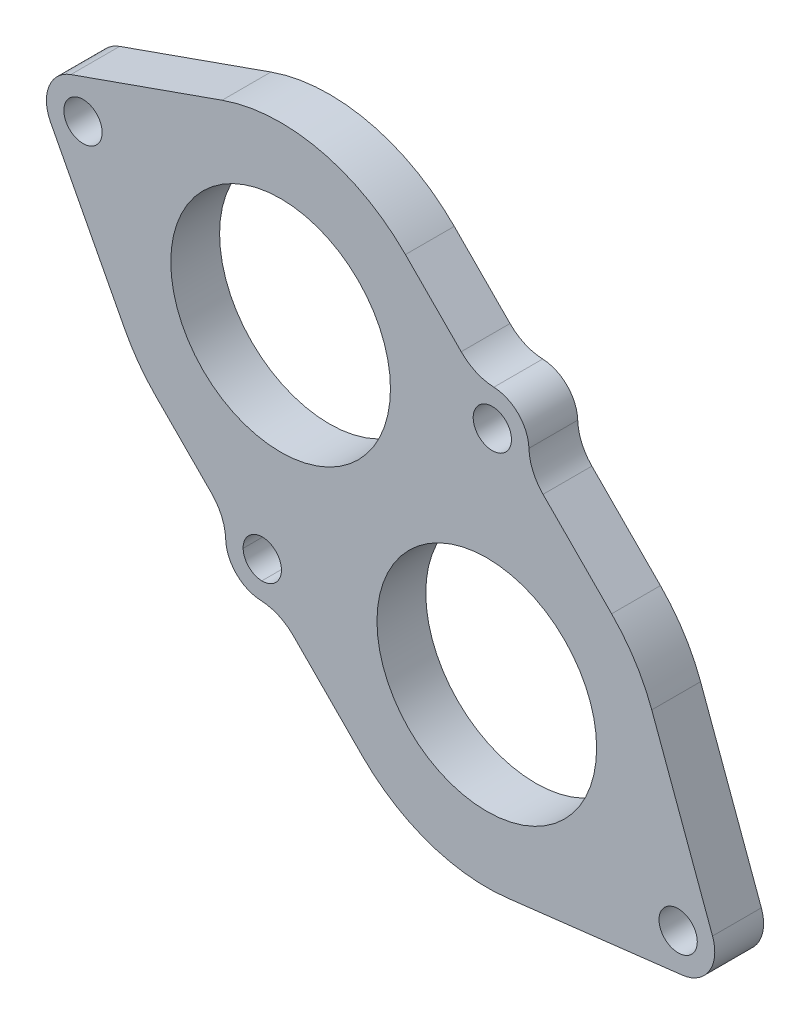
ISO-10303-21;
HEADER;
FILE_DESCRIPTION(('STEP AP214'),'2;1');
FILE_NAME('part.step','',(''),(''),'','','');
FILE_SCHEMA(('AUTOMOTIVE_DESIGN { 1 0 10303 214 1 1 1 1 }'));
ENDSEC;
DATA;
#1=APPLICATION_CONTEXT('core data for automotive mechanical design processes');
#2=APPLICATION_PROTOCOL_DEFINITION('international standard','automotive_design',2000,#1);
#3=PRODUCT_CONTEXT('',#1,'mechanical');
#4=PRODUCT('Part','Part','',(#3));
#5=PRODUCT_RELATED_PRODUCT_CATEGORY('part','',(#4));
#6=PRODUCT_DEFINITION_FORMATION('','',#4);
#7=PRODUCT_DEFINITION_CONTEXT('part definition',#1,'design');
#8=PRODUCT_DEFINITION('design','',#6,#7);
#9=PRODUCT_DEFINITION_SHAPE('','',#8);
#10=(LENGTH_UNIT() NAMED_UNIT(*) SI_UNIT(.MILLI.,.METRE.));
#11=(NAMED_UNIT(*) PLANE_ANGLE_UNIT() SI_UNIT($,.RADIAN.));
#12=(NAMED_UNIT(*) SI_UNIT($,.STERADIAN.) SOLID_ANGLE_UNIT());
#13=UNCERTAINTY_MEASURE_WITH_UNIT(LENGTH_MEASURE(1.E-05),#10,'distance_accuracy_value','');
#14=(GEOMETRIC_REPRESENTATION_CONTEXT(3) GLOBAL_UNCERTAINTY_ASSIGNED_CONTEXT((#13)) GLOBAL_UNIT_ASSIGNED_CONTEXT((#10,
#11,#12)) REPRESENTATION_CONTEXT('',''));
#15=CARTESIAN_POINT('',(0.,0.,0.));
#16=DIRECTION('',(0.,0.,1.));
#17=DIRECTION('',(1.,0.,0.));
#18=AXIS2_PLACEMENT_3D('',#15,#16,#17);
#19=CARTESIAN_POINT('',(0.,0.,6.35));
#20=DIRECTION('',(0.,0.,1.));
#21=DIRECTION('',(1.,0.,0.));
#22=AXIS2_PLACEMENT_3D('',#19,#20,#21);
#23=PLANE('',#22);
#24=DIRECTION('',(0.703951008459692,-0.710248532338211,0.));
#25=VECTOR('',#24,1.);
#26=CARTESIAN_POINT('',(3.46941242361215,3.43865036415361,6.35));
#27=LINE('',#26,#25);
#28=CARTESIAN_POINT('',(-173.680077848541,182.172914479443,6.35));
#29=VERTEX_POINT('',#28);
#30=CARTESIAN_POINT('',(-166.426186041319,174.854129581198,6.35));
#31=VERTEX_POINT('',#30);
#32=EDGE_CURVE('E271',#29,#31,#27,.T.);
#33=ORIENTED_EDGE('',*,*,#32,.T.);
#34=CARTESIAN_POINT('',(-170.936264221667,170.384040677479,6.35));
#35=DIRECTION('',(0.,0.,1.));
#36=DIRECTION('',(1.,0.,0.));
#37=AXIS2_PLACEMENT_3D('',#34,#35,#36);
#38=CIRCLE('',#37,6.35);
#39=CARTESIAN_POINT('',(-164.589632999374,170.590854913492,6.35));
#40=VERTEX_POINT('',#39);
#41=EDGE_CURVE('E12',#31,#40,#38,.F.);
#42=ORIENTED_EDGE('',*,*,#41,.T.);
#43=CARTESIAN_POINT('',(-159.829659582655,170.745965590502,6.35));
#44=DIRECTION('',(0.,0.,1.));
#45=DIRECTION('',(1.,0.,0.));
#46=AXIS2_PLACEMENT_3D('',#43,#44,#45);
#47=CIRCLE('',#46,4.76250000000001);
#48=CARTESIAN_POINT('',(-160.027156219006,165.987562357417,6.35));
#49=VERTEX_POINT('',#48);
#50=EDGE_CURVE('E336',#40,#49,#47,.T.);
#51=ORIENTED_EDGE('',*,*,#50,.T.);
#52=CARTESIAN_POINT('',(-160.290485067474,159.643024713305,6.35));
#53=DIRECTION('',(0.,0.,1.));
#54=DIRECTION('',(1.,0.,0.));
#55=AXIS2_PLACEMENT_3D('',#52,#53,#54);
#56=CIRCLE('',#55,6.35);
#57=CARTESIAN_POINT('',(-155.780406887127,164.113113617024,6.35));
#58=VERTEX_POINT('',#57);
#59=EDGE_CURVE('E398',#49,#58,#56,.F.);
#60=ORIENTED_EDGE('',*,*,#59,.T.);
#61=DIRECTION('',(0.703951008459692,-0.710248532338211,0.));
#62=VECTOR('',#61,1.);
#63=CARTESIAN_POINT('',(3.46941242361215,3.43865036415361,6.35));
#64=LINE('',#63,#62);
#65=CARTESIAN_POINT('',(-146.859544426227,155.112445397357,6.35));
#66=VERTEX_POINT('',#65);
#67=EDGE_CURVE('E404',#58,#66,#64,.T.);
#68=ORIENTED_EDGE('',*,*,#67,.T.);
#69=CARTESIAN_POINT('',(-130.623262976975,171.204765450746,6.35));
#70=DIRECTION('',(0.,0.,1.));
#71=DIRECTION('',(1.,0.,0.));
#72=AXIS2_PLACEMENT_3D('',#69,#70,#71);
#73=CIRCLE('',#72,22.86);
#74=CARTESIAN_POINT('',(-127.94297476679,148.502438364952,6.35));
#75=VERTEX_POINT('',#74);
#76=EDGE_CURVE('E414',#66,#75,#73,.T.);
#77=ORIENTED_EDGE('',*,*,#76,.T.);
#78=DIRECTION('',(-0.993102672169433,-0.117247953201456,0.));
#79=VECTOR('',#78,1.);
#80=CARTESIAN_POINT('',(-19.0503560158122,161.358547833884,6.35));
#81=LINE('',#80,#79);
#82=CARTESIAN_POINT('',(-105.172869599853,151.190728609075,6.35));
#83=VERTEX_POINT('',#82);
#84=EDGE_CURVE('E451',#83,#75,#81,.T.);
#85=ORIENTED_EDGE('',*,*,#84,.F.);
#86=CARTESIAN_POINT('',(-105.731262976975,155.920380085282,6.35));
#87=DIRECTION('',(0.,0.,1.));
#88=DIRECTION('',(1.,0.,0.));
#89=AXIS2_PLACEMENT_3D('',#86,#87,#88);
#90=CIRCLE('',#89,4.7625);
#91=CARTESIAN_POINT('',(-101.26067242215,157.562094537039,6.35));
#92=VERTEX_POINT('',#91);
#93=EDGE_CURVE('E449',#83,#92,#90,.T.);
#94=ORIENTED_EDGE('',*,*,#93,.T.);
#95=DIRECTION('',(-0.344716945250847,0.938706678178506,0.));
#96=VECTOR('',#95,1.);
#97=CARTESIAN_POINT('',(-38.2426711900944,-14.0436806271181,6.35));
#98=LINE('',#97,#96);
#99=CARTESIAN_POINT('',(-109.164428313814,179.08499481918,6.35));
#100=VERTEX_POINT('',#99);
#101=EDGE_CURVE('E447',#92,#100,#98,.T.);
#102=ORIENTED_EDGE('',*,*,#101,.T.);
#103=CARTESIAN_POINT('',(-114.386981527724,187.297085504134,6.35));
#104=VERTEX_POINT('',#103);
#105=EDGE_CURVE('E446',#100,#104,#73,.T.);
#106=ORIENTED_EDGE('',*,*,#105,.T.);
#107=DIRECTION('',(0.703951008459692,-0.710248532338211,0.));
#108=VECTOR('',#107,1.);
#109=CARTESIAN_POINT('',(35.9419753221152,35.6232904709308,6.35));
#110=LINE('',#109,#108);
#111=CARTESIAN_POINT('',(-123.307843988624,196.297753723801,6.35));
#112=VERTEX_POINT('',#111);
#113=EDGE_CURVE('E444',#112,#104,#110,.T.);
#114=ORIENTED_EDGE('',*,*,#113,.F.);
#115=CARTESIAN_POINT('',(-118.797765808276,200.76784262752,6.35));
#116=DIRECTION('',(0.,0.,1.));
#117=DIRECTION('',(1.,0.,0.));
#118=AXIS2_PLACEMENT_3D('',#115,#116,#117);
#119=CIRCLE('',#118,6.35);
#120=CARTESIAN_POINT('',(-125.144397030569,200.561028391506,6.35));
#121=VERTEX_POINT('',#120);
#122=EDGE_CURVE('E394',#112,#121,#119,.F.);
#123=ORIENTED_EDGE('',*,*,#122,.T.);
#124=CARTESIAN_POINT('',(-129.904370447289,200.405917714496,6.35));
#125=DIRECTION('',(0.,0.,1.));
#126=DIRECTION('',(1.,0.,0.));
#127=AXIS2_PLACEMENT_3D('',#124,#125,#126);
#128=CIRCLE('',#127,4.76250000000001);
#129=CARTESIAN_POINT('',(-129.706873810937,205.164320947581,6.35));
#130=VERTEX_POINT('',#129);
#131=EDGE_CURVE('E441',#121,#130,#128,.T.);
#132=ORIENTED_EDGE('',*,*,#131,.T.);
#133=CARTESIAN_POINT('',(-129.443544962469,211.508858591694,6.35));
#134=DIRECTION('',(0.,0.,1.));
#135=DIRECTION('',(1.,0.,0.));
#136=AXIS2_PLACEMENT_3D('',#133,#134,#135);
#137=CIRCLE('',#136,6.35);
#138=CARTESIAN_POINT('',(-133.953623142816,207.038769687975,6.35));
#139=VERTEX_POINT('',#138);
#140=EDGE_CURVE('E390',#130,#139,#137,.F.);
#141=ORIENTED_EDGE('',*,*,#140,.T.);
#142=DIRECTION('',(0.703951008459692,-0.710248532338211,0.));
#143=VECTOR('',#142,1.);
#144=CARTESIAN_POINT('',(35.9419753221152,35.6232904709308,6.35));
#145=LINE('',#144,#143);
#146=CARTESIAN_POINT('',(-141.207514950038,214.35755458622,6.35));
#147=VERTEX_POINT('',#146);
#148=EDGE_CURVE('E438',#147,#139,#145,.T.);
#149=ORIENTED_EDGE('',*,*,#148,.F.);
#150=CARTESIAN_POINT('',(-157.443796399289,198.265234532831,6.35));
#151=DIRECTION('',(0.,0.,1.));
#152=DIRECTION('',(1.,0.,0.));
#153=AXIS2_PLACEMENT_3D('',#150,#151,#152);
#154=CIRCLE('',#153,22.86);
#155=CARTESIAN_POINT('',(-165.055285282897,219.820856467137,6.35));
#156=VERTEX_POINT('',#155);
#157=EDGE_CURVE('E430',#147,#156,#154,.T.);
#158=ORIENTED_EDGE('',*,*,#157,.T.);
#159=DIRECTION('',(0.942940592051869,0.332961018530505,0.));
#160=VECTOR('',#159,1.);
#161=CARTESIAN_POINT('',(-87.3140275148413,247.272011488439,6.35));
#162=LINE('',#161,#160);
#163=CARTESIAN_POINT('',(-184.732785907017,212.872549537551,6.35));
#164=VERTEX_POINT('',#163);
#165=EDGE_CURVE('E435',#164,#156,#162,.T.);
#166=ORIENTED_EDGE('',*,*,#165,.F.);
#167=CARTESIAN_POINT('',(-183.147059056266,208.381794967904,6.35));
#168=DIRECTION('',(0.,0.,1.));
#169=DIRECTION('',(1.,0.,0.));
#170=AXIS2_PLACEMENT_3D('',#167,#168,#169);
#171=CIRCLE('',#170,4.76250000000001);
#172=CARTESIAN_POINT('',(-187.368252425283,206.17658912913,6.35));
#173=VERTEX_POINT('',#172);
#174=EDGE_CURVE('E433',#164,#173,#171,.T.);
#175=ORIENTED_EDGE('',*,*,#174,.T.);
#176=DIRECTION('',(0.463035346724297,-0.886339815016741,0.));
#177=VECTOR('',#176,1.);
#178=CARTESIAN_POINT('',(-62.5799284752205,-32.6925614629623,6.35));
#179=LINE('',#178,#177);
#180=CARTESIAN_POINT('',(-177.705524570572,187.680246506714,6.35));
#181=VERTEX_POINT('',#180);
#182=EDGE_CURVE('E428',#173,#181,#179,.T.);
#183=ORIENTED_EDGE('',*,*,#182,.T.);
#184=EDGE_CURVE('E426',#181,#29,#154,.T.);
#185=ORIENTED_EDGE('',*,*,#184,.T.);
#186=EDGE_LOOP('',(#33,#42,#51,#60,#68,#77,#85,#94,#102,#106,#114,#123,#132,#141,#149,#158,#166,
#175,#183,#185));
#187=FACE_BOUND('',#186,.T.);
#188=CARTESIAN_POINT('',(-129.904370447289,200.405917714496,6.35));
#189=DIRECTION('',(0.,0.,1.));
#190=DIRECTION('',(1.,0.,0.));
#191=AXIS2_PLACEMENT_3D('',#188,#189,#190);
#192=CIRCLE('',#191,2.48920000000003);
#193=CARTESIAN_POINT('',(-127.415170447289,200.405917714496,6.35));
#194=VERTEX_POINT('',#193);
#195=EDGE_CURVE('E265',#194,#194,#192,.T.);
#196=ORIENTED_EDGE('',*,*,#195,.F.);
#197=EDGE_LOOP('',(#196));
#198=FACE_BOUND('',#197,.T.);
#199=CARTESIAN_POINT('',(-157.443796399289,198.265234532831,6.35));
#200=DIRECTION('',(0.,0.,1.));
#201=DIRECTION('',(1.,0.,0.));
#202=AXIS2_PLACEMENT_3D('',#199,#200,#201);
#203=CIRCLE('',#202,14.2874999999995);
#204=CARTESIAN_POINT('',(-143.15629639929,198.265234532831,6.35));
#205=VERTEX_POINT('',#204);
#206=EDGE_CURVE('E264',#205,#205,#203,.T.);
#207=ORIENTED_EDGE('',*,*,#206,.F.);
#208=EDGE_LOOP('',(#207));
#209=FACE_BOUND('',#208,.T.);
#210=CARTESIAN_POINT('',(-130.623262976975,171.204765450746,6.35));
#211=DIRECTION('',(0.,0.,1.));
#212=DIRECTION('',(1.,0.,0.));
#213=AXIS2_PLACEMENT_3D('',#210,#211,#212);
#214=CIRCLE('',#213,14.2874999999999);
#215=CARTESIAN_POINT('',(-116.335762976975,171.204765450746,6.35));
#216=VERTEX_POINT('',#215);
#217=EDGE_CURVE('E268',#216,#216,#214,.T.);
#218=ORIENTED_EDGE('',*,*,#217,.F.);
#219=EDGE_LOOP('',(#218));
#220=FACE_BOUND('',#219,.T.);
#221=CARTESIAN_POINT('',(-183.147059056266,208.381794967904,6.35));
#222=DIRECTION('',(0.,0.,1.));
#223=DIRECTION('',(1.,0.,0.));
#224=AXIS2_PLACEMENT_3D('',#221,#222,#223);
#225=CIRCLE('',#224,2.48920000000001);
#226=CARTESIAN_POINT('',(-180.657859056266,208.381794967904,6.35));
#227=VERTEX_POINT('',#226);
#228=EDGE_CURVE('E277',#227,#227,#225,.T.);
#229=ORIENTED_EDGE('',*,*,#228,.F.);
#230=EDGE_LOOP('',(#229));
#231=FACE_BOUND('',#230,.T.);
#232=CARTESIAN_POINT('',(-105.731262976975,155.920380085282,6.35));
#233=DIRECTION('',(0.,0.,1.));
#234=DIRECTION('',(1.,0.,0.));
#235=AXIS2_PLACEMENT_3D('',#232,#233,#234);
#236=CIRCLE('',#235,2.48920000000002);
#237=CARTESIAN_POINT('',(-103.242062976975,155.920380085282,6.35));
#238=VERTEX_POINT('',#237);
#239=EDGE_CURVE('E280',#238,#238,#236,.T.);
#240=ORIENTED_EDGE('',*,*,#239,.F.);
#241=EDGE_LOOP('',(#240));
#242=FACE_BOUND('',#241,.T.);
#243=CARTESIAN_POINT('',(-159.829659582655,170.745965590502,6.35));
#244=DIRECTION('',(0.,0.,1.));
#245=DIRECTION('',(1.,0.,0.));
#246=AXIS2_PLACEMENT_3D('',#243,#244,#245);
#247=CIRCLE('',#246,2.48920000000001);
#248=CARTESIAN_POINT('',(-162.31859675561,170.709793929194,6.35));
#249=VERTEX_POINT('',#248);
#250=CARTESIAN_POINT('',(-159.887996172836,168.257449269027,6.35));
#251=VERTEX_POINT('',#250);
#252=EDGE_CURVE('E259',#249,#251,#247,.T.);
#253=ORIENTED_EDGE('',*,*,#252,.F.);
#254=CARTESIAN_POINT('',(-159.829659582655,170.745965590502,6.35));
#255=DIRECTION('',(0.,0.,1.));
#256=DIRECTION('',(1.,0.,0.));
#257=AXIS2_PLACEMENT_3D('',#254,#255,#256);
#258=CIRCLE('',#257,2.48920000000001);
#259=EDGE_CURVE('E244',#251,#249,#258,.T.);
#260=ORIENTED_EDGE('',*,*,#259,.F.);
#261=EDGE_LOOP('',(#253,#260));
#262=FACE_BOUND('',#261,.T.);
#263=ADVANCED_FACE('F96',(#187,#198,#209,#220,#231,#242,#262),#23,.T.);
#264=CARTESIAN_POINT('',(0.,0.,0.));
#265=DIRECTION('',(0.,0.,1.));
#266=DIRECTION('',(1.,0.,0.));
#267=AXIS2_PLACEMENT_3D('',#264,#265,#266);
#268=PLANE('',#267);
#269=CARTESIAN_POINT('',(-105.731262976975,155.920380085282,0.));
#270=DIRECTION('',(0.,0.,1.));
#271=DIRECTION('',(1.,0.,0.));
#272=AXIS2_PLACEMENT_3D('',#269,#270,#271);
#273=CIRCLE('',#272,2.48920000000002);
#274=CARTESIAN_POINT('',(-103.242062976975,155.920380085282,0.));
#275=VERTEX_POINT('',#274);
#276=EDGE_CURVE('E333',#275,#275,#273,.T.);
#277=ORIENTED_EDGE('',*,*,#276,.T.);
#278=EDGE_LOOP('',(#277));
#279=FACE_BOUND('',#278,.T.);
#280=CARTESIAN_POINT('',(-183.147059056266,208.381794967904,0.));
#281=DIRECTION('',(0.,0.,1.));
#282=DIRECTION('',(1.,0.,0.));
#283=AXIS2_PLACEMENT_3D('',#280,#281,#282);
#284=CIRCLE('',#283,2.48920000000001);
#285=CARTESIAN_POINT('',(-180.657859056266,208.381794967904,0.));
#286=VERTEX_POINT('',#285);
#287=EDGE_CURVE('E330',#286,#286,#284,.T.);
#288=ORIENTED_EDGE('',*,*,#287,.T.);
#289=EDGE_LOOP('',(#288));
#290=FACE_BOUND('',#289,.T.);
#291=CARTESIAN_POINT('',(-130.623262976975,171.204765450746,0.));
#292=DIRECTION('',(0.,0.,1.));
#293=DIRECTION('',(1.,0.,0.));
#294=AXIS2_PLACEMENT_3D('',#291,#292,#293);
#295=CIRCLE('',#294,14.2874999999999);
#296=CARTESIAN_POINT('',(-116.335762976975,171.204765450746,0.));
#297=VERTEX_POINT('',#296);
#298=EDGE_CURVE('E327',#297,#297,#295,.T.);
#299=ORIENTED_EDGE('',*,*,#298,.T.);
#300=EDGE_LOOP('',(#299));
#301=FACE_BOUND('',#300,.T.);
#302=CARTESIAN_POINT('',(-157.443796399289,198.265234532831,0.));
#303=DIRECTION('',(0.,0.,1.));
#304=DIRECTION('',(1.,0.,0.));
#305=AXIS2_PLACEMENT_3D('',#302,#303,#304);
#306=CIRCLE('',#305,14.2874999999995);
#307=CARTESIAN_POINT('',(-143.15629639929,198.265234532831,0.));
#308=VERTEX_POINT('',#307);
#309=EDGE_CURVE('E324',#308,#308,#306,.T.);
#310=ORIENTED_EDGE('',*,*,#309,.T.);
#311=EDGE_LOOP('',(#310));
#312=FACE_BOUND('',#311,.T.);
#313=CARTESIAN_POINT('',(-129.904370447289,200.405917714496,0.));
#314=DIRECTION('',(0.,0.,1.));
#315=DIRECTION('',(1.,0.,0.));
#316=AXIS2_PLACEMENT_3D('',#313,#314,#315);
#317=CIRCLE('',#316,2.48920000000003);
#318=CARTESIAN_POINT('',(-127.415170447289,200.405917714496,0.));
#319=VERTEX_POINT('',#318);
#320=EDGE_CURVE('E320',#319,#319,#317,.T.);
#321=ORIENTED_EDGE('',*,*,#320,.T.);
#322=EDGE_LOOP('',(#321));
#323=FACE_BOUND('',#322,.T.);
#324=CARTESIAN_POINT('',(-159.829659582655,170.745965590502,0.));
#325=DIRECTION('',(0.,0.,1.));
#326=DIRECTION('',(1.,0.,0.));
#327=AXIS2_PLACEMENT_3D('',#324,#325,#326);
#328=CIRCLE('',#327,4.76250000000001);
#329=CARTESIAN_POINT('',(-164.589632999374,170.590854913492,0.));
#330=VERTEX_POINT('',#329);
#331=CARTESIAN_POINT('',(-160.027156219006,165.987562357417,0.));
#332=VERTEX_POINT('',#331);
#333=EDGE_CURVE('E254',#330,#332,#328,.T.);
#334=ORIENTED_EDGE('',*,*,#333,.F.);
#335=CARTESIAN_POINT('',(-170.936264221667,170.384040677479,0.));
#336=DIRECTION('',(0.,0.,1.));
#337=DIRECTION('',(1.,0.,0.));
#338=AXIS2_PLACEMENT_3D('',#335,#336,#337);
#339=CIRCLE('',#338,6.35);
#340=CARTESIAN_POINT('',(-166.426186041319,174.854129581198,0.));
#341=VERTEX_POINT('',#340);
#342=EDGE_CURVE('E104',#330,#341,#339,.T.);
#343=ORIENTED_EDGE('',*,*,#342,.T.);
#344=DIRECTION('',(0.703951008459692,-0.710248532338211,0.));
#345=VECTOR('',#344,1.);
#346=CARTESIAN_POINT('',(3.46941242361215,3.43865036415361,0.));
#347=LINE('',#346,#345);
#348=CARTESIAN_POINT('',(-173.680077848541,182.172914479443,0.));
#349=VERTEX_POINT('',#348);
#350=EDGE_CURVE('E318',#349,#341,#347,.T.);
#351=ORIENTED_EDGE('',*,*,#350,.F.);
#352=CARTESIAN_POINT('',(-157.443796399289,198.265234532831,0.));
#353=DIRECTION('',(0.,0.,1.));
#354=DIRECTION('',(1.,0.,0.));
#355=AXIS2_PLACEMENT_3D('',#352,#353,#354);
#356=CIRCLE('',#355,22.86);
#357=CARTESIAN_POINT('',(-177.705524570572,187.680246506714,0.));
#358=VERTEX_POINT('',#357);
#359=EDGE_CURVE('E311',#358,#349,#356,.T.);
#360=ORIENTED_EDGE('',*,*,#359,.F.);
#361=DIRECTION('',(0.463035346724297,-0.886339815016741,0.));
#362=VECTOR('',#361,1.);
#363=CARTESIAN_POINT('',(-62.5799284752205,-32.6925614629623,0.));
#364=LINE('',#363,#362);
#365=CARTESIAN_POINT('',(-187.368252425283,206.17658912913,0.));
#366=VERTEX_POINT('',#365);
#367=EDGE_CURVE('E316',#366,#358,#364,.T.);
#368=ORIENTED_EDGE('',*,*,#367,.F.);
#369=CARTESIAN_POINT('',(-183.147059056266,208.381794967904,0.));
#370=DIRECTION('',(0.,0.,1.));
#371=DIRECTION('',(1.,0.,0.));
#372=AXIS2_PLACEMENT_3D('',#369,#370,#371);
#373=CIRCLE('',#372,4.76250000000001);
#374=CARTESIAN_POINT('',(-184.732785907017,212.872549537551,0.));
#375=VERTEX_POINT('',#374);
#376=EDGE_CURVE('E314',#375,#366,#373,.T.);
#377=ORIENTED_EDGE('',*,*,#376,.F.);
#378=DIRECTION('',(0.942940592051869,0.332961018530505,0.));
#379=VECTOR('',#378,1.);
#380=CARTESIAN_POINT('',(-87.3140275148413,247.272011488439,0.));
#381=LINE('',#380,#379);
#382=CARTESIAN_POINT('',(-165.055285282897,219.820856467137,0.));
#383=VERTEX_POINT('',#382);
#384=EDGE_CURVE('E310',#375,#383,#381,.T.);
#385=ORIENTED_EDGE('',*,*,#384,.T.);
#386=CARTESIAN_POINT('',(-141.207514950038,214.35755458622,0.));
#387=VERTEX_POINT('',#386);
#388=EDGE_CURVE('E307',#387,#383,#356,.T.);
#389=ORIENTED_EDGE('',*,*,#388,.F.);
#390=DIRECTION('',(0.703951008459692,-0.710248532338211,0.));
#391=VECTOR('',#390,1.);
#392=CARTESIAN_POINT('',(35.9419753221152,35.6232904709308,0.));
#393=LINE('',#392,#391);
#394=CARTESIAN_POINT('',(-133.953623142816,207.038769687975,0.));
#395=VERTEX_POINT('',#394);
#396=EDGE_CURVE('E304',#387,#395,#393,.T.);
#397=ORIENTED_EDGE('',*,*,#396,.T.);
#398=CARTESIAN_POINT('',(-129.443544962469,211.508858591694,0.));
#399=DIRECTION('',(0.,0.,1.));
#400=DIRECTION('',(1.,0.,0.));
#401=AXIS2_PLACEMENT_3D('',#398,#399,#400);
#402=CIRCLE('',#401,6.35);
#403=CARTESIAN_POINT('',(-129.706873810937,205.164320947581,0.));
#404=VERTEX_POINT('',#403);
#405=EDGE_CURVE('E388',#395,#404,#402,.T.);
#406=ORIENTED_EDGE('',*,*,#405,.T.);
#407=CARTESIAN_POINT('',(-129.904370447289,200.405917714496,0.));
#408=DIRECTION('',(0.,0.,1.));
#409=DIRECTION('',(1.,0.,0.));
#410=AXIS2_PLACEMENT_3D('',#407,#408,#409);
#411=CIRCLE('',#410,4.76250000000001);
#412=CARTESIAN_POINT('',(-125.144397030569,200.561028391506,0.));
#413=VERTEX_POINT('',#412);
#414=EDGE_CURVE('E301',#413,#404,#411,.T.);
#415=ORIENTED_EDGE('',*,*,#414,.F.);
#416=CARTESIAN_POINT('',(-118.797765808276,200.76784262752,0.));
#417=DIRECTION('',(0.,0.,1.));
#418=DIRECTION('',(1.,0.,0.));
#419=AXIS2_PLACEMENT_3D('',#416,#417,#418);
#420=CIRCLE('',#419,6.35);
#421=CARTESIAN_POINT('',(-123.307843988624,196.297753723801,0.));
#422=VERTEX_POINT('',#421);
#423=EDGE_CURVE('E392',#413,#422,#420,.T.);
#424=ORIENTED_EDGE('',*,*,#423,.T.);
#425=DIRECTION('',(0.703951008459692,-0.710248532338211,0.));
#426=VECTOR('',#425,1.);
#427=CARTESIAN_POINT('',(35.9419753221152,35.6232904709308,0.));
#428=LINE('',#427,#426);
#429=CARTESIAN_POINT('',(-114.386981527724,187.297085504134,0.));
#430=VERTEX_POINT('',#429);
#431=EDGE_CURVE('E299',#422,#430,#428,.T.);
#432=ORIENTED_EDGE('',*,*,#431,.T.);
#433=CARTESIAN_POINT('',(-130.623262976975,171.204765450746,0.));
#434=DIRECTION('',(0.,0.,1.));
#435=DIRECTION('',(1.,0.,0.));
#436=AXIS2_PLACEMENT_3D('',#433,#434,#435);
#437=CIRCLE('',#436,22.86);
#438=CARTESIAN_POINT('',(-109.164428313814,179.08499481918,0.));
#439=VERTEX_POINT('',#438);
#440=EDGE_CURVE('E292',#439,#430,#437,.T.);
#441=ORIENTED_EDGE('',*,*,#440,.F.);
#442=DIRECTION('',(-0.344716945250847,0.938706678178506,0.));
#443=VECTOR('',#442,1.);
#444=CARTESIAN_POINT('',(-38.2426711900944,-14.0436806271181,0.));
#445=LINE('',#444,#443);
#446=CARTESIAN_POINT('',(-101.26067242215,157.562094537039,0.));
#447=VERTEX_POINT('',#446);
#448=EDGE_CURVE('E297',#447,#439,#445,.T.);
#449=ORIENTED_EDGE('',*,*,#448,.F.);
#450=CARTESIAN_POINT('',(-105.731262976975,155.920380085282,0.));
#451=DIRECTION('',(0.,0.,1.));
#452=DIRECTION('',(1.,0.,0.));
#453=AXIS2_PLACEMENT_3D('',#450,#451,#452);
#454=CIRCLE('',#453,4.7625);
#455=CARTESIAN_POINT('',(-105.172869599853,151.190728609075,0.));
#456=VERTEX_POINT('',#455);
#457=EDGE_CURVE('E295',#456,#447,#454,.T.);
#458=ORIENTED_EDGE('',*,*,#457,.F.);
#459=DIRECTION('',(-0.993102672169433,-0.117247953201456,0.));
#460=VECTOR('',#459,1.);
#461=CARTESIAN_POINT('',(-19.0503560158122,161.358547833884,0.));
#462=LINE('',#461,#460);
#463=CARTESIAN_POINT('',(-127.94297476679,148.502438364952,0.));
#464=VERTEX_POINT('',#463);
#465=EDGE_CURVE('E291',#456,#464,#462,.T.);
#466=ORIENTED_EDGE('',*,*,#465,.T.);
#467=CARTESIAN_POINT('',(-146.859544426227,155.112445397357,0.));
#468=VERTEX_POINT('',#467);
#469=EDGE_CURVE('E288',#468,#464,#437,.T.);
#470=ORIENTED_EDGE('',*,*,#469,.F.);
#471=DIRECTION('',(0.703951008459692,-0.710248532338211,0.));
#472=VECTOR('',#471,1.);
#473=CARTESIAN_POINT('',(3.46941242361215,3.43865036415361,0.));
#474=LINE('',#473,#472);
#475=CARTESIAN_POINT('',(-155.780406887127,164.113113617024,0.));
#476=VERTEX_POINT('',#475);
#477=EDGE_CURVE('E286',#476,#468,#474,.T.);
#478=ORIENTED_EDGE('',*,*,#477,.F.);
#479=CARTESIAN_POINT('',(-160.290485067474,159.643024713305,0.));
#480=DIRECTION('',(0.,0.,1.));
#481=DIRECTION('',(1.,0.,0.));
#482=AXIS2_PLACEMENT_3D('',#479,#480,#481);
#483=CIRCLE('',#482,6.35);
#484=EDGE_CURVE('E396',#476,#332,#483,.T.);
#485=ORIENTED_EDGE('',*,*,#484,.T.);
#486=EDGE_LOOP('',(#334,#343,#351,#360,#368,#377,#385,#389,#397,#406,#415,#424,#432,#441,#449,
#458,#466,#470,#478,#485));
#487=FACE_BOUND('',#486,.T.);
#488=CARTESIAN_POINT('',(-159.829659582655,170.745965590502,0.));
#489=DIRECTION('',(0.,0.,1.));
#490=DIRECTION('',(1.,0.,0.));
#491=AXIS2_PLACEMENT_3D('',#488,#489,#490);
#492=CIRCLE('',#491,2.48920000000001);
#493=CARTESIAN_POINT('',(-162.31859675561,170.709793929194,0.));
#494=VERTEX_POINT('',#493);
#495=CARTESIAN_POINT('',(-159.887996172836,168.257449269027,0.));
#496=VERTEX_POINT('',#495);
#497=EDGE_CURVE('E262',#494,#496,#492,.F.);
#498=ORIENTED_EDGE('',*,*,#497,.F.);
#499=CARTESIAN_POINT('',(-159.829659582655,170.745965590502,0.));
#500=DIRECTION('',(0.,0.,1.));
#501=DIRECTION('',(1.,0.,0.));
#502=AXIS2_PLACEMENT_3D('',#499,#500,#501);
#503=CIRCLE('',#502,2.48920000000001);
#504=EDGE_CURVE('E261',#494,#496,#503,.T.);
#505=ORIENTED_EDGE('',*,*,#504,.T.);
#506=EDGE_LOOP('',(#498,#505));
#507=FACE_BOUND('',#506,.T.);
#508=ADVANCED_FACE('F417',(#279,#290,#301,#312,#323,#487,#507),#268,.F.);
#509=CARTESIAN_POINT('',(-159.829659582655,170.745965590502,6.35));
#510=DIRECTION('',(0.,0.,-1.));
#511=DIRECTION('',(-1.,0.,0.));
#512=AXIS2_PLACEMENT_3D('',#509,#510,#511);
#513=CYLINDRICAL_SURFACE('',#512,2.48920000000001);
#514=ORIENTED_EDGE('',*,*,#504,.F.);
#515=DIRECTION('',(0.,0.,-1.));
#516=VECTOR('',#515,1.);
#517=CARTESIAN_POINT('',(-162.31859675561,170.709793929194,6.35));
#518=LINE('',#517,#516);
#519=EDGE_CURVE('E247',#249,#494,#518,.T.);
#520=ORIENTED_EDGE('',*,*,#519,.F.);
#521=ORIENTED_EDGE('',*,*,#252,.T.);
#522=DIRECTION('',(0.,0.,-1.));
#523=VECTOR('',#522,1.);
#524=CARTESIAN_POINT('',(-159.887996172836,168.257449269027,6.35));
#525=LINE('',#524,#523);
#526=EDGE_CURVE('E250',#251,#496,#525,.T.);
#527=ORIENTED_EDGE('',*,*,#526,.T.);
#528=EDGE_LOOP('',(#514,#520,#521,#527));
#529=FACE_BOUND('',#528,.T.);
#530=ADVANCED_FACE('F258',(#529),#513,.F.);
#531=CARTESIAN_POINT('',(-159.829659582655,170.745965590502,6.35));
#532=DIRECTION('',(0.,0.,-1.));
#533=DIRECTION('',(-1.,0.,0.));
#534=AXIS2_PLACEMENT_3D('',#531,#532,#533);
#535=CYLINDRICAL_SURFACE('',#534,4.76250000000001);
#536=ORIENTED_EDGE('',*,*,#333,.T.);
#537=DIRECTION('',(0.,0.,-1.));
#538=VECTOR('',#537,1.);
#539=CARTESIAN_POINT('',(-160.027156219006,165.987562357417,6.35));
#540=LINE('',#539,#538);
#541=EDGE_CURVE('E385',#332,#49,#540,.F.);
#542=ORIENTED_EDGE('',*,*,#541,.T.);
#543=ORIENTED_EDGE('',*,*,#50,.F.);
#544=DIRECTION('',(0.,0.,-1.));
#545=VECTOR('',#544,1.);
#546=CARTESIAN_POINT('',(-164.589632999374,170.590854913492,6.35));
#547=LINE('',#546,#545);
#548=EDGE_CURVE('E382',#40,#330,#547,.T.);
#549=ORIENTED_EDGE('',*,*,#548,.T.);
#550=EDGE_LOOP('',(#536,#542,#543,#549));
#551=FACE_BOUND('',#550,.T.);
#552=ADVANCED_FACE('F421',(#551),#535,.T.);
#553=CARTESIAN_POINT('',(3.46941242361215,3.43865036415361,6.35));
#554=DIRECTION('',(0.710248532338211,0.703951008459692,0.));
#555=DIRECTION('',(-0.703951008459692,0.710248532338211,0.));
#556=AXIS2_PLACEMENT_3D('',#553,#554,#555);
#557=PLANE('',#556);
#558=ORIENTED_EDGE('',*,*,#67,.F.);
#559=DIRECTION('',(0.,0.,1.));
#560=VECTOR('',#559,1.);
#561=CARTESIAN_POINT('',(-155.780406887127,164.113113617024,0.));
#562=LINE('',#561,#560);
#563=EDGE_CURVE('E379',#58,#476,#562,.F.);
#564=ORIENTED_EDGE('',*,*,#563,.T.);
#565=ORIENTED_EDGE('',*,*,#477,.T.);
#566=DIRECTION('',(0.,0.,-1.));
#567=VECTOR('',#566,1.);
#568=CARTESIAN_POINT('',(-146.859544426227,155.112445397357,6.35));
#569=LINE('',#568,#567);
#570=EDGE_CURVE('E337',#66,#468,#569,.T.);
#571=ORIENTED_EDGE('',*,*,#570,.F.);
#572=EDGE_LOOP('',(#558,#564,#565,#571));
#573=FACE_BOUND('',#572,.T.);
#574=ADVANCED_FACE('F411',(#573),#557,.F.);
#575=CARTESIAN_POINT('',(-130.623262976975,171.204765450746,6.35));
#576=DIRECTION('',(0.,0.,-1.));
#577=DIRECTION('',(-1.,0.,0.));
#578=AXIS2_PLACEMENT_3D('',#575,#576,#577);
#579=CYLINDRICAL_SURFACE('',#578,22.86);
#580=ORIENTED_EDGE('',*,*,#469,.T.);
#581=DIRECTION('',(0.,0.,-1.));
#582=VECTOR('',#581,1.);
#583=CARTESIAN_POINT('',(-127.94297476679,148.502438364952,6.35));
#584=LINE('',#583,#582);
#585=EDGE_CURVE('E364',#75,#464,#584,.T.);
#586=ORIENTED_EDGE('',*,*,#585,.F.);
#587=ORIENTED_EDGE('',*,*,#76,.F.);
#588=ORIENTED_EDGE('',*,*,#570,.T.);
#589=EDGE_LOOP('',(#580,#586,#587,#588));
#590=FACE_BOUND('',#589,.T.);
#591=ADVANCED_FACE('F523',(#590),#579,.T.);
#592=CARTESIAN_POINT('',(-19.0503560158122,161.358547833884,6.35));
#593=DIRECTION('',(0.117247953201456,-0.993102672169433,0.));
#594=DIRECTION('',(0.993102672169433,0.117247953201456,0.));
#595=AXIS2_PLACEMENT_3D('',#592,#593,#594);
#596=PLANE('',#595);
#597=ORIENTED_EDGE('',*,*,#465,.F.);
#598=DIRECTION('',(0.,0.,-1.));
#599=VECTOR('',#598,1.);
#600=CARTESIAN_POINT('',(-105.172869599853,151.190728609075,6.35));
#601=LINE('',#600,#599);
#602=EDGE_CURVE('E362',#83,#456,#601,.T.);
#603=ORIENTED_EDGE('',*,*,#602,.F.);
#604=ORIENTED_EDGE('',*,*,#84,.T.);
#605=ORIENTED_EDGE('',*,*,#585,.T.);
#606=EDGE_LOOP('',(#597,#603,#604,#605));
#607=FACE_BOUND('',#606,.T.);
#608=ADVANCED_FACE('F521',(#607),#596,.T.);
#609=CARTESIAN_POINT('',(-105.731262976975,155.920380085282,6.35));
#610=DIRECTION('',(0.,0.,-1.));
#611=DIRECTION('',(-1.,0.,0.));
#612=AXIS2_PLACEMENT_3D('',#609,#610,#611);
#613=CYLINDRICAL_SURFACE('',#612,4.7625);
#614=ORIENTED_EDGE('',*,*,#457,.T.);
#615=DIRECTION('',(0.,0.,-1.));
#616=VECTOR('',#615,1.);
#617=CARTESIAN_POINT('',(-101.26067242215,157.562094537039,6.35));
#618=LINE('',#617,#616);
#619=EDGE_CURVE('E359',#92,#447,#618,.T.);
#620=ORIENTED_EDGE('',*,*,#619,.F.);
#621=ORIENTED_EDGE('',*,*,#93,.F.);
#622=ORIENTED_EDGE('',*,*,#602,.T.);
#623=EDGE_LOOP('',(#614,#620,#621,#622));
#624=FACE_BOUND('',#623,.T.);
#625=ADVANCED_FACE('F519',(#624),#613,.T.);
#626=CARTESIAN_POINT('',(-38.2426711900944,-14.0436806271181,6.35));
#627=DIRECTION('',(-0.938706678178506,-0.344716945250847,0.));
#628=DIRECTION('',(0.344716945250847,-0.938706678178506,0.));
#629=AXIS2_PLACEMENT_3D('',#626,#627,#628);
#630=PLANE('',#629);
#631=ORIENTED_EDGE('',*,*,#448,.T.);
#632=DIRECTION('',(0.,0.,-1.));
#633=VECTOR('',#632,1.);
#634=CARTESIAN_POINT('',(-109.164428313814,179.08499481918,6.35));
#635=LINE('',#634,#633);
#636=EDGE_CURVE('E356',#100,#439,#635,.T.);
#637=ORIENTED_EDGE('',*,*,#636,.F.);
#638=ORIENTED_EDGE('',*,*,#101,.F.);
#639=ORIENTED_EDGE('',*,*,#619,.T.);
#640=EDGE_LOOP('',(#631,#637,#638,#639));
#641=FACE_BOUND('',#640,.T.);
#642=ADVANCED_FACE('F515',(#641),#630,.F.);
#643=ORIENTED_EDGE('',*,*,#440,.T.);
#644=DIRECTION('',(0.,0.,-1.));
#645=VECTOR('',#644,1.);
#646=CARTESIAN_POINT('',(-114.386981527724,187.297085504134,6.35));
#647=LINE('',#646,#645);
#648=EDGE_CURVE('E353',#104,#430,#647,.T.);
#649=ORIENTED_EDGE('',*,*,#648,.F.);
#650=ORIENTED_EDGE('',*,*,#105,.F.);
#651=ORIENTED_EDGE('',*,*,#636,.T.);
#652=EDGE_LOOP('',(#643,#649,#650,#651));
#653=FACE_BOUND('',#652,.T.);
#654=ADVANCED_FACE('F466',(#653),#579,.T.);
#655=CARTESIAN_POINT('',(35.9419753221152,35.6232904709308,6.35));
#656=DIRECTION('',(0.710248532338211,0.703951008459692,0.));
#657=DIRECTION('',(-0.703951008459692,0.710248532338211,0.));
#658=AXIS2_PLACEMENT_3D('',#655,#656,#657);
#659=PLANE('',#658);
#660=ORIENTED_EDGE('',*,*,#431,.F.);
#661=DIRECTION('',(0.,0.,-1.));
#662=VECTOR('',#661,1.);
#663=CARTESIAN_POINT('',(-123.307843988624,196.297753723801,6.35));
#664=LINE('',#663,#662);
#665=EDGE_CURVE('E377',#422,#112,#664,.F.);
#666=ORIENTED_EDGE('',*,*,#665,.T.);
#667=ORIENTED_EDGE('',*,*,#113,.T.);
#668=ORIENTED_EDGE('',*,*,#648,.T.);
#669=EDGE_LOOP('',(#660,#666,#667,#668));
#670=FACE_BOUND('',#669,.T.);
#671=ADVANCED_FACE('F470',(#670),#659,.T.);
#672=CARTESIAN_POINT('',(-129.904370447289,200.405917714496,6.35));
#673=DIRECTION('',(0.,0.,-1.));
#674=DIRECTION('',(-1.,0.,0.));
#675=AXIS2_PLACEMENT_3D('',#672,#673,#674);
#676=CYLINDRICAL_SURFACE('',#675,4.76250000000001);
#677=ORIENTED_EDGE('',*,*,#414,.T.);
#678=DIRECTION('',(0.,0.,-1.));
#679=VECTOR('',#678,1.);
#680=CARTESIAN_POINT('',(-129.706873810937,205.164320947581,6.35));
#681=LINE('',#680,#679);
#682=EDGE_CURVE('E375',#404,#130,#681,.F.);
#683=ORIENTED_EDGE('',*,*,#682,.T.);
#684=ORIENTED_EDGE('',*,*,#131,.F.);
#685=DIRECTION('',(0.,0.,-1.));
#686=VECTOR('',#685,1.);
#687=CARTESIAN_POINT('',(-125.144397030569,200.561028391506,6.35));
#688=LINE('',#687,#686);
#689=EDGE_CURVE('E372',#121,#413,#688,.T.);
#690=ORIENTED_EDGE('',*,*,#689,.T.);
#691=EDGE_LOOP('',(#677,#683,#684,#690));
#692=FACE_BOUND('',#691,.T.);
#693=ADVANCED_FACE('F478',(#692),#676,.T.);
#694=CARTESIAN_POINT('',(35.9419753221152,35.6232904709308,6.35));
#695=DIRECTION('',(0.710248532338211,0.703951008459692,0.));
#696=DIRECTION('',(-0.703951008459692,0.710248532338211,0.));
#697=AXIS2_PLACEMENT_3D('',#694,#695,#696);
#698=PLANE('',#697);
#699=ORIENTED_EDGE('',*,*,#148,.T.);
#700=DIRECTION('',(0.,0.,-1.));
#701=VECTOR('',#700,1.);
#702=CARTESIAN_POINT('',(-133.953623142816,207.038769687975,6.35));
#703=LINE('',#702,#701);
#704=EDGE_CURVE('E369',#139,#395,#703,.T.);
#705=ORIENTED_EDGE('',*,*,#704,.T.);
#706=ORIENTED_EDGE('',*,*,#396,.F.);
#707=DIRECTION('',(0.,0.,-1.));
#708=VECTOR('',#707,1.);
#709=CARTESIAN_POINT('',(-141.207514950038,214.35755458622,6.35));
#710=LINE('',#709,#708);
#711=EDGE_CURVE('E351',#147,#387,#710,.T.);
#712=ORIENTED_EDGE('',*,*,#711,.F.);
#713=EDGE_LOOP('',(#699,#705,#706,#712));
#714=FACE_BOUND('',#713,.T.);
#715=ADVANCED_FACE('F486',(#714),#698,.T.);
#716=CARTESIAN_POINT('',(-157.443796399289,198.265234532831,6.35));
#717=DIRECTION('',(0.,0.,-1.));
#718=DIRECTION('',(-1.,0.,0.));
#719=AXIS2_PLACEMENT_3D('',#716,#717,#718);
#720=CYLINDRICAL_SURFACE('',#719,22.86);
#721=ORIENTED_EDGE('',*,*,#388,.T.);
#722=DIRECTION('',(0.,0.,-1.));
#723=VECTOR('',#722,1.);
#724=CARTESIAN_POINT('',(-165.055285282897,219.820856467137,6.35));
#725=LINE('',#724,#723);
#726=EDGE_CURVE('E349',#156,#383,#725,.T.);
#727=ORIENTED_EDGE('',*,*,#726,.F.);
#728=ORIENTED_EDGE('',*,*,#157,.F.);
#729=ORIENTED_EDGE('',*,*,#711,.T.);
#730=EDGE_LOOP('',(#721,#727,#728,#729));
#731=FACE_BOUND('',#730,.T.);
#732=ADVANCED_FACE('F492',(#731),#720,.T.);
#733=CARTESIAN_POINT('',(-87.3140275148413,247.272011488439,6.35));
#734=DIRECTION('',(-0.332961018530505,0.942940592051869,0.));
#735=DIRECTION('',(-0.942940592051869,-0.332961018530505,0.));
#736=AXIS2_PLACEMENT_3D('',#733,#734,#735);
#737=PLANE('',#736);
#738=ORIENTED_EDGE('',*,*,#384,.F.);
#739=DIRECTION('',(0.,0.,-1.));
#740=VECTOR('',#739,1.);
#741=CARTESIAN_POINT('',(-184.732785907017,212.872549537551,6.35));
#742=LINE('',#741,#740);
#743=EDGE_CURVE('E347',#164,#375,#742,.T.);
#744=ORIENTED_EDGE('',*,*,#743,.F.);
#745=ORIENTED_EDGE('',*,*,#165,.T.);
#746=ORIENTED_EDGE('',*,*,#726,.T.);
#747=EDGE_LOOP('',(#738,#744,#745,#746));
#748=FACE_BOUND('',#747,.T.);
#749=ADVANCED_FACE('F498',(#748),#737,.T.);
#750=CARTESIAN_POINT('',(-183.147059056266,208.381794967904,6.35));
#751=DIRECTION('',(0.,0.,-1.));
#752=DIRECTION('',(-1.,0.,0.));
#753=AXIS2_PLACEMENT_3D('',#750,#751,#752);
#754=CYLINDRICAL_SURFACE('',#753,4.76250000000001);
#755=ORIENTED_EDGE('',*,*,#376,.T.);
#756=DIRECTION('',(0.,0.,-1.));
#757=VECTOR('',#756,1.);
#758=CARTESIAN_POINT('',(-187.368252425283,206.17658912913,6.35));
#759=LINE('',#758,#757);
#760=EDGE_CURVE('E344',#173,#366,#759,.T.);
#761=ORIENTED_EDGE('',*,*,#760,.F.);
#762=ORIENTED_EDGE('',*,*,#174,.F.);
#763=ORIENTED_EDGE('',*,*,#743,.T.);
#764=EDGE_LOOP('',(#755,#761,#762,#763));
#765=FACE_BOUND('',#764,.T.);
#766=ADVANCED_FACE('F501',(#765),#754,.T.);
#767=CARTESIAN_POINT('',(-62.5799284752205,-32.6925614629623,6.35));
#768=DIRECTION('',(0.886339815016741,0.463035346724296,0.));
#769=DIRECTION('',(-0.463035346724297,0.886339815016741,0.));
#770=AXIS2_PLACEMENT_3D('',#767,#768,#769);
#771=PLANE('',#770);
#772=ORIENTED_EDGE('',*,*,#367,.T.);
#773=DIRECTION('',(0.,0.,-1.));
#774=VECTOR('',#773,1.);
#775=CARTESIAN_POINT('',(-177.705524570572,187.680246506714,6.35));
#776=LINE('',#775,#774);
#777=EDGE_CURVE('E341',#181,#358,#776,.T.);
#778=ORIENTED_EDGE('',*,*,#777,.F.);
#779=ORIENTED_EDGE('',*,*,#182,.F.);
#780=ORIENTED_EDGE('',*,*,#760,.T.);
#781=EDGE_LOOP('',(#772,#778,#779,#780));
#782=FACE_BOUND('',#781,.T.);
#783=ADVANCED_FACE('F506',(#782),#771,.F.);
#784=ORIENTED_EDGE('',*,*,#359,.T.);
#785=DIRECTION('',(0.,0.,-1.));
#786=VECTOR('',#785,1.);
#787=CARTESIAN_POINT('',(-173.680077848541,182.172914479443,6.35));
#788=LINE('',#787,#786);
#789=EDGE_CURVE('E283',#29,#349,#788,.T.);
#790=ORIENTED_EDGE('',*,*,#789,.F.);
#791=ORIENTED_EDGE('',*,*,#184,.F.);
#792=ORIENTED_EDGE('',*,*,#777,.T.);
#793=EDGE_LOOP('',(#784,#790,#791,#792));
#794=FACE_BOUND('',#793,.T.);
#795=ADVANCED_FACE('F509',(#794),#720,.T.);
#796=CARTESIAN_POINT('',(-183.147059056266,208.381794967904,6.35));
#797=DIRECTION('',(0.,0.,-1.));
#798=DIRECTION('',(-1.,0.,0.));
#799=AXIS2_PLACEMENT_3D('',#796,#797,#798);
#800=CYLINDRICAL_SURFACE('',#799,2.48920000000001);
#801=ORIENTED_EDGE('',*,*,#228,.T.);
#802=EDGE_LOOP('',(#801));
#803=FACE_BOUND('',#802,.T.);
#804=ORIENTED_EDGE('',*,*,#287,.F.);
#805=EDGE_LOOP('',(#804));
#806=FACE_BOUND('',#805,.T.);
#807=ADVANCED_FACE('F550',(#803,#806),#800,.F.);
#808=CARTESIAN_POINT('',(-130.623262976975,171.204765450746,6.35));
#809=DIRECTION('',(0.,0.,-1.));
#810=DIRECTION('',(-1.,0.,0.));
#811=AXIS2_PLACEMENT_3D('',#808,#809,#810);
#812=CYLINDRICAL_SURFACE('',#811,14.2874999999999);
#813=ORIENTED_EDGE('',*,*,#217,.T.);
#814=EDGE_LOOP('',(#813));
#815=FACE_BOUND('',#814,.T.);
#816=ORIENTED_EDGE('',*,*,#298,.F.);
#817=EDGE_LOOP('',(#816));
#818=FACE_BOUND('',#817,.T.);
#819=ADVANCED_FACE('F553',(#815,#818),#812,.F.);
#820=CARTESIAN_POINT('',(-157.443796399289,198.265234532831,6.35));
#821=DIRECTION('',(0.,0.,-1.));
#822=DIRECTION('',(-1.,0.,0.));
#823=AXIS2_PLACEMENT_3D('',#820,#821,#822);
#824=CYLINDRICAL_SURFACE('',#823,14.2874999999995);
#825=ORIENTED_EDGE('',*,*,#206,.T.);
#826=EDGE_LOOP('',(#825));
#827=FACE_BOUND('',#826,.T.);
#828=ORIENTED_EDGE('',*,*,#309,.F.);
#829=EDGE_LOOP('',(#828));
#830=FACE_BOUND('',#829,.T.);
#831=ADVANCED_FACE('F557',(#827,#830),#824,.F.);
#832=CARTESIAN_POINT('',(-129.904370447289,200.405917714496,6.35));
#833=DIRECTION('',(0.,0.,-1.));
#834=DIRECTION('',(-1.,0.,0.));
#835=AXIS2_PLACEMENT_3D('',#832,#833,#834);
#836=CYLINDRICAL_SURFACE('',#835,2.48920000000003);
#837=ORIENTED_EDGE('',*,*,#195,.T.);
#838=EDGE_LOOP('',(#837));
#839=FACE_BOUND('',#838,.T.);
#840=ORIENTED_EDGE('',*,*,#320,.F.);
#841=EDGE_LOOP('',(#840));
#842=FACE_BOUND('',#841,.T.);
#843=ADVANCED_FACE('F561',(#839,#842),#836,.F.);
#844=CARTESIAN_POINT('',(3.46941242361215,3.43865036415361,6.35));
#845=DIRECTION('',(0.710248532338211,0.703951008459692,0.));
#846=DIRECTION('',(-0.703951008459692,0.710248532338211,0.));
#847=AXIS2_PLACEMENT_3D('',#844,#845,#846);
#848=PLANE('',#847);
#849=ORIENTED_EDGE('',*,*,#350,.T.);
#850=DIRECTION('',(0.,0.,1.));
#851=VECTOR('',#850,1.);
#852=CARTESIAN_POINT('',(-166.426186041319,174.854129581198,6.35));
#853=LINE('',#852,#851);
#854=EDGE_CURVE('E111',#341,#31,#853,.T.);
#855=ORIENTED_EDGE('',*,*,#854,.T.);
#856=ORIENTED_EDGE('',*,*,#32,.F.);
#857=ORIENTED_EDGE('',*,*,#789,.T.);
#858=EDGE_LOOP('',(#849,#855,#856,#857));
#859=FACE_BOUND('',#858,.T.);
#860=ADVANCED_FACE('F510',(#859),#848,.F.);
#861=CARTESIAN_POINT('',(-105.731262976975,155.920380085282,6.35));
#862=DIRECTION('',(0.,0.,-1.));
#863=DIRECTION('',(-1.,0.,0.));
#864=AXIS2_PLACEMENT_3D('',#861,#862,#863);
#865=CYLINDRICAL_SURFACE('',#864,2.48920000000002);
#866=ORIENTED_EDGE('',*,*,#239,.T.);
#867=EDGE_LOOP('',(#866));
#868=FACE_BOUND('',#867,.T.);
#869=ORIENTED_EDGE('',*,*,#276,.F.);
#870=EDGE_LOOP('',(#869));
#871=FACE_BOUND('',#870,.T.);
#872=ADVANCED_FACE('F546',(#868,#871),#865,.F.);
#873=CARTESIAN_POINT('',(-159.829659582655,170.745965590502,6.35));
#874=DIRECTION('',(0.,0.,-1.));
#875=DIRECTION('',(-1.,0.,0.));
#876=AXIS2_PLACEMENT_3D('',#873,#874,#875);
#877=CYLINDRICAL_SURFACE('',#876,2.48920000000001);
#878=ORIENTED_EDGE('',*,*,#526,.F.);
#879=ORIENTED_EDGE('',*,*,#259,.T.);
#880=ORIENTED_EDGE('',*,*,#519,.T.);
#881=ORIENTED_EDGE('',*,*,#497,.T.);
#882=EDGE_LOOP('',(#878,#879,#880,#881));
#883=FACE_BOUND('',#882,.T.);
#884=ADVANCED_FACE('F246',(#883),#877,.F.);
#885=CARTESIAN_POINT('',(-129.443544962469,211.508858591694,6.35));
#886=DIRECTION('',(0.,0.,-1.));
#887=DIRECTION('',(-1.,0.,0.));
#888=AXIS2_PLACEMENT_3D('',#885,#886,#887);
#889=CYLINDRICAL_SURFACE('',#888,6.35);
#890=ORIENTED_EDGE('',*,*,#140,.F.);
#891=ORIENTED_EDGE('',*,*,#682,.F.);
#892=ORIENTED_EDGE('',*,*,#405,.F.);
#893=ORIENTED_EDGE('',*,*,#704,.F.);
#894=EDGE_LOOP('',(#890,#891,#892,#893));
#895=FACE_BOUND('',#894,.T.);
#896=ADVANCED_FACE('F482',(#895),#889,.F.);
#897=CARTESIAN_POINT('',(-118.797765808276,200.76784262752,6.35));
#898=DIRECTION('',(0.,0.,-1.));
#899=DIRECTION('',(-1.,0.,0.));
#900=AXIS2_PLACEMENT_3D('',#897,#898,#899);
#901=CYLINDRICAL_SURFACE('',#900,6.35);
#902=ORIENTED_EDGE('',*,*,#122,.F.);
#903=ORIENTED_EDGE('',*,*,#665,.F.);
#904=ORIENTED_EDGE('',*,*,#423,.F.);
#905=ORIENTED_EDGE('',*,*,#689,.F.);
#906=EDGE_LOOP('',(#902,#903,#904,#905));
#907=FACE_BOUND('',#906,.T.);
#908=ADVANCED_FACE('F473',(#907),#901,.F.);
#909=CARTESIAN_POINT('',(-160.290485067474,159.643024713305,6.35));
#910=DIRECTION('',(0.,0.,-1.));
#911=DIRECTION('',(-1.,0.,0.));
#912=AXIS2_PLACEMENT_3D('',#909,#910,#911);
#913=CYLINDRICAL_SURFACE('',#912,6.35);
#914=ORIENTED_EDGE('',*,*,#59,.F.);
#915=ORIENTED_EDGE('',*,*,#541,.F.);
#916=ORIENTED_EDGE('',*,*,#484,.F.);
#917=ORIENTED_EDGE('',*,*,#563,.F.);
#918=EDGE_LOOP('',(#914,#915,#916,#917));
#919=FACE_BOUND('',#918,.T.);
#920=ADVANCED_FACE('F416',(#919),#913,.F.);
#921=CARTESIAN_POINT('',(-170.936264221667,170.384040677479,6.35));
#922=DIRECTION('',(0.,0.,-1.));
#923=DIRECTION('',(-1.,0.,0.));
#924=AXIS2_PLACEMENT_3D('',#921,#922,#923);
#925=CYLINDRICAL_SURFACE('',#924,6.35);
#926=ORIENTED_EDGE('',*,*,#41,.F.);
#927=ORIENTED_EDGE('',*,*,#854,.F.);
#928=ORIENTED_EDGE('',*,*,#342,.F.);
#929=ORIENTED_EDGE('',*,*,#548,.F.);
#930=EDGE_LOOP('',(#926,#927,#928,#929));
#931=FACE_BOUND('',#930,.T.);
#932=ADVANCED_FACE('F98',(#931),#925,.F.);
#933=CLOSED_SHELL('',(#263,#508,#530,#552,#574,#591,#608,#625,#642,#654,#671,#693,#715,#732,
#749,#766,#783,#795,#807,#819,#831,#843,#860,#872,#884,#896,#908,#920,#932));
#934=MANIFOLD_SOLID_BREP('B2',#933);
#935=ADVANCED_BREP_SHAPE_REPRESENTATION('',(#18,#934),#14);
#936=SHAPE_DEFINITION_REPRESENTATION(#9,#935);
ENDSEC;
END-ISO-10303-21;
